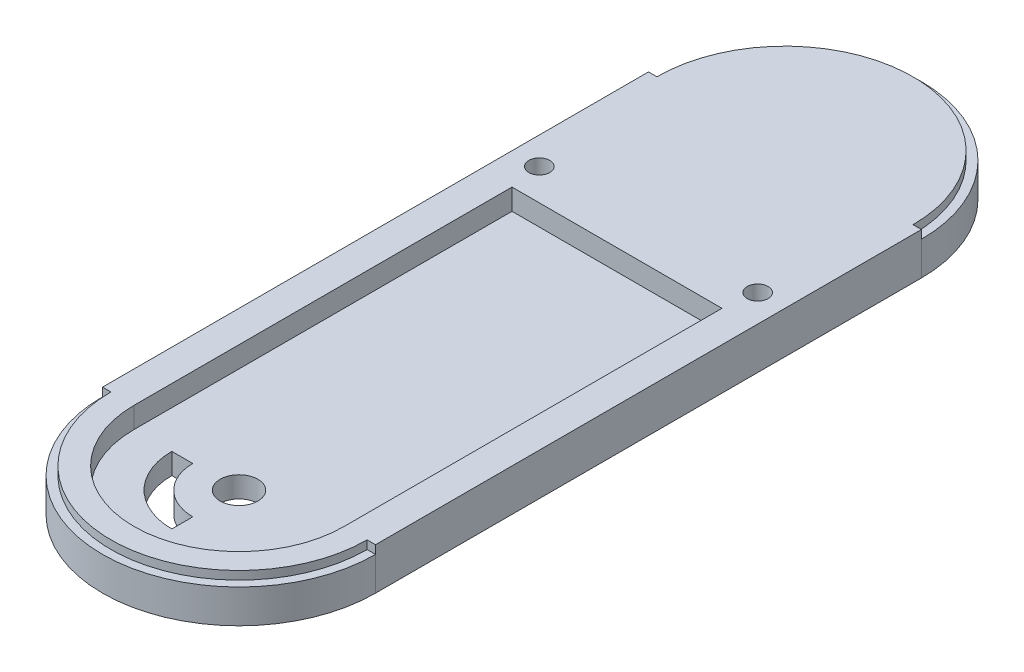
ISO-10303-21;
HEADER;
FILE_DESCRIPTION(('STEP AP214'),'2;1');
FILE_NAME('part.step','',(''),(''),'','','');
FILE_SCHEMA(('AUTOMOTIVE_DESIGN { 1 0 10303 214 1 1 1 1 }'));
ENDSEC;
DATA;
#1=APPLICATION_CONTEXT('core data for automotive mechanical design processes');
#2=APPLICATION_PROTOCOL_DEFINITION('international standard','automotive_design',2000,#1);
#3=PRODUCT_CONTEXT('',#1,'mechanical');
#4=PRODUCT('Part','Part','',(#3));
#5=PRODUCT_RELATED_PRODUCT_CATEGORY('part','',(#4));
#6=PRODUCT_DEFINITION_FORMATION('','',#4);
#7=PRODUCT_DEFINITION_CONTEXT('part definition',#1,'design');
#8=PRODUCT_DEFINITION('design','',#6,#7);
#9=PRODUCT_DEFINITION_SHAPE('','',#8);
#10=(LENGTH_UNIT() NAMED_UNIT(*) SI_UNIT(.MILLI.,.METRE.));
#11=(NAMED_UNIT(*) PLANE_ANGLE_UNIT() SI_UNIT($,.RADIAN.));
#12=(NAMED_UNIT(*) SI_UNIT($,.STERADIAN.) SOLID_ANGLE_UNIT());
#13=UNCERTAINTY_MEASURE_WITH_UNIT(LENGTH_MEASURE(1.E-05),#10,'distance_accuracy_value','');
#14=(GEOMETRIC_REPRESENTATION_CONTEXT(3) GLOBAL_UNCERTAINTY_ASSIGNED_CONTEXT((#13)) GLOBAL_UNIT_ASSIGNED_CONTEXT((#10,
#11,#12)) REPRESENTATION_CONTEXT('',''));
#15=CARTESIAN_POINT('',(0.,0.,0.));
#16=DIRECTION('',(0.,0.,1.));
#17=DIRECTION('',(1.,0.,0.));
#18=AXIS2_PLACEMENT_3D('',#15,#16,#17);
#19=CARTESIAN_POINT('',(0.,10.,65.));
#20=DIRECTION('',(0.,-1.,0.));
#21=DIRECTION('',(0.,0.,-1.));
#22=AXIS2_PLACEMENT_3D('',#19,#20,#21);
#23=CYLINDRICAL_SURFACE('',#22,32.5);
#24=CARTESIAN_POINT('',(0.,8.,65.));
#25=DIRECTION('',(0.,1.,0.));
#26=DIRECTION('',(0.,0.,1.));
#27=AXIS2_PLACEMENT_3D('',#24,#25,#26);
#28=CIRCLE('',#27,32.5);
#29=CARTESIAN_POINT('',(-32.5,8.,65.));
#30=VERTEX_POINT('',#29);
#31=CARTESIAN_POINT('',(32.5,8.,65.));
#32=VERTEX_POINT('',#31);
#33=EDGE_CURVE('E201',#30,#32,#28,.T.);
#34=ORIENTED_EDGE('',*,*,#33,.F.);
#35=DIRECTION('',(0.,-1.,0.));
#36=VECTOR('',#35,1.);
#37=CARTESIAN_POINT('',(-32.5,10.,65.));
#38=LINE('',#37,#36);
#39=CARTESIAN_POINT('',(-32.5,0.,65.));
#40=VERTEX_POINT('',#39);
#41=EDGE_CURVE('E311',#30,#40,#38,.T.);
#42=ORIENTED_EDGE('',*,*,#41,.T.);
#43=CARTESIAN_POINT('',(0.,0.,65.));
#44=DIRECTION('',(0.,1.,0.));
#45=DIRECTION('',(0.,0.,-1.));
#46=AXIS2_PLACEMENT_3D('',#43,#44,#45);
#47=CIRCLE('',#46,32.5);
#48=CARTESIAN_POINT('',(32.5,0.,65.));
#49=VERTEX_POINT('',#48);
#50=EDGE_CURVE('E302',#40,#49,#47,.T.);
#51=ORIENTED_EDGE('',*,*,#50,.T.);
#52=DIRECTION('',(0.,-1.,0.));
#53=VECTOR('',#52,1.);
#54=CARTESIAN_POINT('',(32.5,10.,65.));
#55=LINE('',#54,#53);
#56=EDGE_CURVE('E308',#32,#49,#55,.T.);
#57=ORIENTED_EDGE('',*,*,#56,.F.);
#58=EDGE_LOOP('',(#34,#42,#51,#57));
#59=FACE_BOUND('',#58,.T.);
#60=ADVANCED_FACE('F40',(#59),#23,.T.);
#61=CARTESIAN_POINT('',(0.,10.,-65.0000000000001));
#62=DIRECTION('',(0.,-1.,0.));
#63=DIRECTION('',(0.,0.,-1.));
#64=AXIS2_PLACEMENT_3D('',#61,#62,#63);
#65=CYLINDRICAL_SURFACE('',#64,32.5);
#66=DIRECTION('',(0.,-1.,0.));
#67=VECTOR('',#66,1.);
#68=CARTESIAN_POINT('',(-32.5,10.,-65.0000000000001));
#69=LINE('',#68,#67);
#70=CARTESIAN_POINT('',(-32.5,8.,-65.0000000000001));
#71=VERTEX_POINT('',#70);
#72=CARTESIAN_POINT('',(-32.5,0.,-65.0000000000001));
#73=VERTEX_POINT('',#72);
#74=EDGE_CURVE('E48',#71,#73,#69,.T.);
#75=ORIENTED_EDGE('',*,*,#74,.F.);
#76=CARTESIAN_POINT('',(0.,8.,-65.0000000000001));
#77=DIRECTION('',(0.,1.,0.));
#78=DIRECTION('',(0.,0.,1.));
#79=AXIS2_PLACEMENT_3D('',#76,#77,#78);
#80=CIRCLE('',#79,32.5);
#81=CARTESIAN_POINT('',(32.5,8.,-65.0000000000001));
#82=VERTEX_POINT('',#81);
#83=EDGE_CURVE('E181',#82,#71,#80,.T.);
#84=ORIENTED_EDGE('',*,*,#83,.F.);
#85=DIRECTION('',(0.,-1.,0.));
#86=VECTOR('',#85,1.);
#87=CARTESIAN_POINT('',(32.5,10.,-65.0000000000001));
#88=LINE('',#87,#86);
#89=CARTESIAN_POINT('',(32.5,0.,-65.0000000000001));
#90=VERTEX_POINT('',#89);
#91=EDGE_CURVE('E296',#82,#90,#88,.T.);
#92=ORIENTED_EDGE('',*,*,#91,.T.);
#93=CARTESIAN_POINT('',(0.,0.,-65.0000000000001));
#94=DIRECTION('',(0.,1.,0.));
#95=DIRECTION('',(0.,0.,-1.));
#96=AXIS2_PLACEMENT_3D('',#93,#94,#95);
#97=CIRCLE('',#96,32.5);
#98=EDGE_CURVE('E282',#90,#73,#97,.T.);
#99=ORIENTED_EDGE('',*,*,#98,.T.);
#100=EDGE_LOOP('',(#75,#84,#92,#99));
#101=FACE_BOUND('',#100,.T.);
#102=ADVANCED_FACE('F42',(#101),#65,.T.);
#103=CARTESIAN_POINT('',(-32.5,10.,-65.0000000000001));
#104=DIRECTION('',(1.,0.,0.));
#105=DIRECTION('',(0.,0.,-1.));
#106=AXIS2_PLACEMENT_3D('',#103,#104,#105);
#107=PLANE('',#106);
#108=DIRECTION('',(0.,0.,1.));
#109=VECTOR('',#108,1.);
#110=CARTESIAN_POINT('',(-32.5,0.,-65.0000000000001));
#111=LINE('',#110,#109);
#112=EDGE_CURVE('E299',#73,#40,#111,.T.);
#113=ORIENTED_EDGE('',*,*,#112,.T.);
#114=ORIENTED_EDGE('',*,*,#41,.F.);
#115=CARTESIAN_POINT('',(-32.5,10.,65.));
#116=VERTEX_POINT('',#115);
#117=EDGE_CURVE('E312',#116,#30,#38,.T.);
#118=ORIENTED_EDGE('',*,*,#117,.F.);
#119=DIRECTION('',(0.,0.,1.));
#120=VECTOR('',#119,1.);
#121=CARTESIAN_POINT('',(-32.5,10.,-65.0000000000001));
#122=LINE('',#121,#120);
#123=CARTESIAN_POINT('',(-32.5,10.,-65.0000000000001));
#124=VERTEX_POINT('',#123);
#125=EDGE_CURVE('E289',#124,#116,#122,.T.);
#126=ORIENTED_EDGE('',*,*,#125,.F.);
#127=EDGE_CURVE('E11',#124,#71,#69,.T.);
#128=ORIENTED_EDGE('',*,*,#127,.T.);
#129=ORIENTED_EDGE('',*,*,#74,.T.);
#130=EDGE_LOOP('',(#113,#114,#118,#126,#128,#129));
#131=FACE_BOUND('',#130,.T.);
#132=ADVANCED_FACE('F324',(#131),#107,.F.);
#133=CARTESIAN_POINT('',(32.5,10.,-65.0000000000001));
#134=DIRECTION('',(-1.,0.,0.));
#135=DIRECTION('',(0.,0.,1.));
#136=AXIS2_PLACEMENT_3D('',#133,#134,#135);
#137=PLANE('',#136);
#138=DIRECTION('',(0.,0.,-1.));
#139=VECTOR('',#138,1.);
#140=CARTESIAN_POINT('',(32.5,0.,-65.0000000000001));
#141=LINE('',#140,#139);
#142=EDGE_CURVE('E293',#49,#90,#141,.T.);
#143=ORIENTED_EDGE('',*,*,#142,.T.);
#144=ORIENTED_EDGE('',*,*,#91,.F.);
#145=CARTESIAN_POINT('',(32.5,10.,-65.0000000000001));
#146=VERTEX_POINT('',#145);
#147=EDGE_CURVE('E178',#146,#82,#88,.T.);
#148=ORIENTED_EDGE('',*,*,#147,.F.);
#149=DIRECTION('',(0.,0.,-1.));
#150=VECTOR('',#149,1.);
#151=CARTESIAN_POINT('',(32.5,10.,-65.0000000000001));
#152=LINE('',#151,#150);
#153=CARTESIAN_POINT('',(32.5,10.,65.));
#154=VERTEX_POINT('',#153);
#155=EDGE_CURVE('E292',#154,#146,#152,.T.);
#156=ORIENTED_EDGE('',*,*,#155,.F.);
#157=EDGE_CURVE('E309',#154,#32,#55,.T.);
#158=ORIENTED_EDGE('',*,*,#157,.T.);
#159=ORIENTED_EDGE('',*,*,#56,.T.);
#160=EDGE_LOOP('',(#143,#144,#148,#156,#158,#159));
#161=FACE_BOUND('',#160,.T.);
#162=ADVANCED_FACE('F331',(#161),#137,.F.);
#163=CARTESIAN_POINT('',(0.,10.,-65.0000000000001));
#164=DIRECTION('',(0.,-1.,0.));
#165=DIRECTION('',(0.,0.,-1.));
#166=AXIS2_PLACEMENT_3D('',#163,#164,#165);
#167=PLANE('',#166);
#168=CARTESIAN_POINT('',(26.,10.,-32.5000000000001));
#169=DIRECTION('',(0.,1.,0.));
#170=DIRECTION('',(0.,0.,1.));
#171=AXIS2_PLACEMENT_3D('',#168,#169,#170);
#172=CIRCLE('',#171,2.5);
#173=CARTESIAN_POINT('',(26.,10.,-30.0000000000001));
#174=VERTEX_POINT('',#173);
#175=EDGE_CURVE('E437',#174,#174,#172,.T.);
#176=ORIENTED_EDGE('',*,*,#175,.F.);
#177=EDGE_LOOP('',(#176));
#178=FACE_BOUND('',#177,.T.);
#179=CARTESIAN_POINT('',(-26.,10.,-32.5000000000001));
#180=DIRECTION('',(0.,1.,0.));
#181=DIRECTION('',(0.,0.,1.));
#182=AXIS2_PLACEMENT_3D('',#179,#180,#181);
#183=CIRCLE('',#182,2.5);
#184=CARTESIAN_POINT('',(-26.,10.,-30.0000000000001));
#185=VERTEX_POINT('',#184);
#186=EDGE_CURVE('E191',#185,#185,#183,.T.);
#187=ORIENTED_EDGE('',*,*,#186,.F.);
#188=EDGE_LOOP('',(#187));
#189=FACE_BOUND('',#188,.T.);
#190=DIRECTION('',(0.,0.,-1.));
#191=VECTOR('',#190,1.);
#192=CARTESIAN_POINT('',(25.,10.,-25.));
#193=LINE('',#192,#191);
#194=CARTESIAN_POINT('',(25.,10.,65.));
#195=VERTEX_POINT('',#194);
#196=CARTESIAN_POINT('',(25.,10.,-25.));
#197=VERTEX_POINT('',#196);
#198=EDGE_CURVE('E272',#195,#197,#193,.T.);
#199=ORIENTED_EDGE('',*,*,#198,.F.);
#200=CARTESIAN_POINT('',(0.,10.,65.));
#201=DIRECTION('',(0.,1.,0.));
#202=DIRECTION('',(0.,0.,-1.));
#203=AXIS2_PLACEMENT_3D('',#200,#201,#202);
#204=CIRCLE('',#203,25.);
#205=CARTESIAN_POINT('',(-25.,10.,65.));
#206=VERTEX_POINT('',#205);
#207=EDGE_CURVE('E254',#206,#195,#204,.T.);
#208=ORIENTED_EDGE('',*,*,#207,.F.);
#209=DIRECTION('',(0.,0.,1.));
#210=VECTOR('',#209,1.);
#211=CARTESIAN_POINT('',(-25.,10.,65.));
#212=LINE('',#211,#210);
#213=CARTESIAN_POINT('',(-25.,10.,-25.));
#214=VERTEX_POINT('',#213);
#215=EDGE_CURVE('E261',#214,#206,#212,.T.);
#216=ORIENTED_EDGE('',*,*,#215,.F.);
#217=DIRECTION('',(-1.,0.,0.));
#218=VECTOR('',#217,1.);
#219=CARTESIAN_POINT('',(-25.,10.,-25.));
#220=LINE('',#219,#218);
#221=EDGE_CURVE('E275',#197,#214,#220,.T.);
#222=ORIENTED_EDGE('',*,*,#221,.F.);
#223=EDGE_LOOP('',(#199,#208,#216,#222));
#224=FACE_BOUND('',#223,.T.);
#225=CARTESIAN_POINT('',(0.,10.,-65.0000000000001));
#226=DIRECTION('',(0.,-1.,0.));
#227=DIRECTION('',(0.,0.,-1.));
#228=AXIS2_PLACEMENT_3D('',#225,#226,#227);
#229=CIRCLE('',#228,30.5);
#230=CARTESIAN_POINT('',(-30.5,10.,-65.0000000000001));
#231=VERTEX_POINT('',#230);
#232=CARTESIAN_POINT('',(30.5,10.,-65.0000000000001));
#233=VERTEX_POINT('',#232);
#234=EDGE_CURVE('E55',#231,#233,#229,.T.);
#235=ORIENTED_EDGE('',*,*,#234,.F.);
#236=DIRECTION('',(1.,0.,0.));
#237=VECTOR('',#236,1.);
#238=CARTESIAN_POINT('',(-30.5,10.,-65.0000000000001));
#239=LINE('',#238,#237);
#240=EDGE_CURVE('E185',#124,#231,#239,.T.);
#241=ORIENTED_EDGE('',*,*,#240,.F.);
#242=ORIENTED_EDGE('',*,*,#125,.T.);
#243=DIRECTION('',(-1.,0.,0.));
#244=VECTOR('',#243,1.);
#245=CARTESIAN_POINT('',(-32.5,10.,65.));
#246=LINE('',#245,#244);
#247=CARTESIAN_POINT('',(-30.5,10.,65.));
#248=VERTEX_POINT('',#247);
#249=EDGE_CURVE('E205',#248,#116,#246,.T.);
#250=ORIENTED_EDGE('',*,*,#249,.F.);
#251=CARTESIAN_POINT('',(0.,10.,65.));
#252=DIRECTION('',(0.,-1.,0.));
#253=DIRECTION('',(0.,0.,1.));
#254=AXIS2_PLACEMENT_3D('',#251,#252,#253);
#255=CIRCLE('',#254,30.5);
#256=CARTESIAN_POINT('',(30.5,10.,65.));
#257=VERTEX_POINT('',#256);
#258=EDGE_CURVE('E218',#257,#248,#255,.T.);
#259=ORIENTED_EDGE('',*,*,#258,.F.);
#260=DIRECTION('',(-1.,0.,0.));
#261=VECTOR('',#260,1.);
#262=CARTESIAN_POINT('',(30.5,10.,65.));
#263=LINE('',#262,#261);
#264=EDGE_CURVE('E215',#154,#257,#263,.T.);
#265=ORIENTED_EDGE('',*,*,#264,.F.);
#266=ORIENTED_EDGE('',*,*,#155,.T.);
#267=DIRECTION('',(1.,0.,0.));
#268=VECTOR('',#267,1.);
#269=CARTESIAN_POINT('',(30.5,10.,-65.0000000000001));
#270=LINE('',#269,#268);
#271=EDGE_CURVE('E188',#233,#146,#270,.T.);
#272=ORIENTED_EDGE('',*,*,#271,.F.);
#273=EDGE_LOOP('',(#235,#241,#242,#250,#259,#265,#266,#272));
#274=FACE_BOUND('',#273,.T.);
#275=ADVANCED_FACE('F338',(#178,#189,#224,#274),#167,.F.);
#276=CARTESIAN_POINT('',(0.,0.,-65.0000000000001));
#277=DIRECTION('',(0.,-1.,0.));
#278=DIRECTION('',(0.,0.,-1.));
#279=AXIS2_PLACEMENT_3D('',#276,#277,#278);
#280=PLANE('',#279);
#281=CARTESIAN_POINT('',(26.,0.,-32.5000000000001));
#282=DIRECTION('',(0.,1.,0.));
#283=DIRECTION('',(0.,0.,1.));
#284=AXIS2_PLACEMENT_3D('',#281,#282,#283);
#285=CIRCLE('',#284,2.5);
#286=CARTESIAN_POINT('',(26.,0.,-30.0000000000001));
#287=VERTEX_POINT('',#286);
#288=EDGE_CURVE('E219',#287,#287,#285,.T.);
#289=ORIENTED_EDGE('',*,*,#288,.T.);
#290=EDGE_LOOP('',(#289));
#291=FACE_BOUND('',#290,.T.);
#292=CARTESIAN_POINT('',(-26.,0.,-32.5000000000001));
#293=DIRECTION('',(0.,1.,0.));
#294=DIRECTION('',(0.,0.,1.));
#295=AXIS2_PLACEMENT_3D('',#292,#293,#294);
#296=CIRCLE('',#295,2.5);
#297=CARTESIAN_POINT('',(-26.,0.,-30.0000000000001));
#298=VERTEX_POINT('',#297);
#299=EDGE_CURVE('E438',#298,#298,#296,.T.);
#300=ORIENTED_EDGE('',*,*,#299,.T.);
#301=EDGE_LOOP('',(#300));
#302=FACE_BOUND('',#301,.T.);
#303=CARTESIAN_POINT('',(0.,0.,65.));
#304=DIRECTION('',(0.,-1.,0.));
#305=DIRECTION('',(0.,0.,-1.));
#306=AXIS2_PLACEMENT_3D('',#303,#304,#305);
#307=CIRCLE('',#306,11.);
#308=CARTESIAN_POINT('',(-11.,0.,65.));
#309=VERTEX_POINT('',#308);
#310=CARTESIAN_POINT('',(0.,0.,76.));
#311=VERTEX_POINT('',#310);
#312=EDGE_CURVE('E248',#309,#311,#307,.F.);
#313=ORIENTED_EDGE('',*,*,#312,.F.);
#314=DIRECTION('',(1.,0.,0.));
#315=VECTOR('',#314,1.);
#316=CARTESIAN_POINT('',(0.,0.,65.));
#317=LINE('',#316,#315);
#318=CARTESIAN_POINT('',(-16.,0.,65.));
#319=VERTEX_POINT('',#318);
#320=EDGE_CURVE('E237',#319,#309,#317,.T.);
#321=ORIENTED_EDGE('',*,*,#320,.F.);
#322=CARTESIAN_POINT('',(0.,0.,65.));
#323=DIRECTION('',(0.,-1.,0.));
#324=DIRECTION('',(0.,0.,-1.));
#325=AXIS2_PLACEMENT_3D('',#322,#323,#324);
#326=CIRCLE('',#325,16.);
#327=CARTESIAN_POINT('',(0.,0.,81.));
#328=VERTEX_POINT('',#327);
#329=EDGE_CURVE('E244',#328,#319,#326,.T.);
#330=ORIENTED_EDGE('',*,*,#329,.F.);
#331=DIRECTION('',(0.,0.,1.));
#332=VECTOR('',#331,1.);
#333=CARTESIAN_POINT('',(0.,0.,-65.0000000000001));
#334=LINE('',#333,#332);
#335=EDGE_CURVE('E246',#311,#328,#334,.T.);
#336=ORIENTED_EDGE('',*,*,#335,.F.);
#337=EDGE_LOOP('',(#313,#321,#330,#336));
#338=FACE_BOUND('',#337,.T.);
#339=CARTESIAN_POINT('',(0.,0.,65.));
#340=DIRECTION('',(0.,1.,0.));
#341=DIRECTION('',(0.,0.,1.));
#342=AXIS2_PLACEMENT_3D('',#339,#340,#341);
#343=CIRCLE('',#342,4.5);
#344=CARTESIAN_POINT('',(0.,0.,69.5));
#345=VERTEX_POINT('',#344);
#346=EDGE_CURVE('E251',#345,#345,#343,.T.);
#347=ORIENTED_EDGE('',*,*,#346,.T.);
#348=EDGE_LOOP('',(#347));
#349=FACE_BOUND('',#348,.T.);
#350=ORIENTED_EDGE('',*,*,#98,.F.);
#351=ORIENTED_EDGE('',*,*,#142,.F.);
#352=ORIENTED_EDGE('',*,*,#50,.F.);
#353=ORIENTED_EDGE('',*,*,#112,.F.);
#354=EDGE_LOOP('',(#350,#351,#352,#353));
#355=FACE_BOUND('',#354,.T.);
#356=ADVANCED_FACE('F328',(#291,#302,#338,#349,#355),#280,.T.);
#357=CARTESIAN_POINT('',(0.,5.,65.));
#358=DIRECTION('',(0.,1.,0.));
#359=DIRECTION('',(0.,0.,1.));
#360=AXIS2_PLACEMENT_3D('',#357,#358,#359);
#361=CYLINDRICAL_SURFACE('',#360,25.);
#362=ORIENTED_EDGE('',*,*,#207,.T.);
#363=DIRECTION('',(0.,1.,0.));
#364=VECTOR('',#363,1.);
#365=CARTESIAN_POINT('',(25.,5.,65.));
#366=LINE('',#365,#364);
#367=CARTESIAN_POINT('',(25.,5.,65.));
#368=VERTEX_POINT('',#367);
#369=EDGE_CURVE('E270',#368,#195,#366,.T.);
#370=ORIENTED_EDGE('',*,*,#369,.F.);
#371=CARTESIAN_POINT('',(0.,5.,65.));
#372=DIRECTION('',(0.,1.,0.));
#373=DIRECTION('',(0.,0.,-1.));
#374=AXIS2_PLACEMENT_3D('',#371,#372,#373);
#375=CIRCLE('',#374,25.);
#376=CARTESIAN_POINT('',(-25.,5.,65.));
#377=VERTEX_POINT('',#376);
#378=EDGE_CURVE('E257',#377,#368,#375,.T.);
#379=ORIENTED_EDGE('',*,*,#378,.F.);
#380=DIRECTION('',(0.,1.,0.));
#381=VECTOR('',#380,1.);
#382=CARTESIAN_POINT('',(-25.,5.,65.));
#383=LINE('',#382,#381);
#384=EDGE_CURVE('E280',#377,#206,#383,.T.);
#385=ORIENTED_EDGE('',*,*,#384,.T.);
#386=EDGE_LOOP('',(#362,#370,#379,#385));
#387=FACE_BOUND('',#386,.T.);
#388=ADVANCED_FACE('F364',(#387),#361,.F.);
#389=CARTESIAN_POINT('',(-25.,5.,65.));
#390=DIRECTION('',(-1.,0.,0.));
#391=DIRECTION('',(0.,0.,1.));
#392=AXIS2_PLACEMENT_3D('',#389,#390,#391);
#393=PLANE('',#392);
#394=ORIENTED_EDGE('',*,*,#215,.T.);
#395=ORIENTED_EDGE('',*,*,#384,.F.);
#396=DIRECTION('',(0.,0.,1.));
#397=VECTOR('',#396,1.);
#398=CARTESIAN_POINT('',(-25.,5.,65.));
#399=LINE('',#398,#397);
#400=CARTESIAN_POINT('',(-25.,5.,-25.));
#401=VERTEX_POINT('',#400);
#402=EDGE_CURVE('E267',#401,#377,#399,.T.);
#403=ORIENTED_EDGE('',*,*,#402,.F.);
#404=DIRECTION('',(0.,1.,0.));
#405=VECTOR('',#404,1.);
#406=CARTESIAN_POINT('',(-25.,5.,-25.));
#407=LINE('',#406,#405);
#408=EDGE_CURVE('E283',#401,#214,#407,.T.);
#409=ORIENTED_EDGE('',*,*,#408,.T.);
#410=EDGE_LOOP('',(#394,#395,#403,#409));
#411=FACE_BOUND('',#410,.T.);
#412=ADVANCED_FACE('F371',(#411),#393,.F.);
#413=CARTESIAN_POINT('',(-25.,5.,-25.));
#414=DIRECTION('',(0.,0.,-1.));
#415=DIRECTION('',(-1.,0.,0.));
#416=AXIS2_PLACEMENT_3D('',#413,#414,#415);
#417=PLANE('',#416);
#418=ORIENTED_EDGE('',*,*,#221,.T.);
#419=ORIENTED_EDGE('',*,*,#408,.F.);
#420=DIRECTION('',(-1.,0.,0.));
#421=VECTOR('',#420,1.);
#422=CARTESIAN_POINT('',(-25.,5.,-25.));
#423=LINE('',#422,#421);
#424=CARTESIAN_POINT('',(25.,5.,-25.));
#425=VERTEX_POINT('',#424);
#426=EDGE_CURVE('E264',#425,#401,#423,.T.);
#427=ORIENTED_EDGE('',*,*,#426,.F.);
#428=DIRECTION('',(0.,1.,0.));
#429=VECTOR('',#428,1.);
#430=CARTESIAN_POINT('',(25.,5.,-25.));
#431=LINE('',#430,#429);
#432=EDGE_CURVE('E285',#425,#197,#431,.T.);
#433=ORIENTED_EDGE('',*,*,#432,.T.);
#434=EDGE_LOOP('',(#418,#419,#427,#433));
#435=FACE_BOUND('',#434,.T.);
#436=ADVANCED_FACE('F377',(#435),#417,.F.);
#437=CARTESIAN_POINT('',(25.,5.,-25.));
#438=DIRECTION('',(1.,0.,0.));
#439=DIRECTION('',(0.,0.,-1.));
#440=AXIS2_PLACEMENT_3D('',#437,#438,#439);
#441=PLANE('',#440);
#442=ORIENTED_EDGE('',*,*,#198,.T.);
#443=ORIENTED_EDGE('',*,*,#432,.F.);
#444=DIRECTION('',(0.,0.,-1.));
#445=VECTOR('',#444,1.);
#446=CARTESIAN_POINT('',(25.,5.,-25.));
#447=LINE('',#446,#445);
#448=EDGE_CURVE('E260',#368,#425,#447,.T.);
#449=ORIENTED_EDGE('',*,*,#448,.F.);
#450=ORIENTED_EDGE('',*,*,#369,.T.);
#451=EDGE_LOOP('',(#442,#443,#449,#450));
#452=FACE_BOUND('',#451,.T.);
#453=ADVANCED_FACE('F373',(#452),#441,.F.);
#454=CARTESIAN_POINT('',(0.,5.,65.));
#455=DIRECTION('',(0.,-1.,0.));
#456=DIRECTION('',(0.,0.,-1.));
#457=AXIS2_PLACEMENT_3D('',#454,#455,#456);
#458=PLANE('',#457);
#459=DIRECTION('',(-1.,0.,0.));
#460=VECTOR('',#459,1.);
#461=CARTESIAN_POINT('',(-16.,5.,65.));
#462=LINE('',#461,#460);
#463=CARTESIAN_POINT('',(-11.,5.,65.));
#464=VERTEX_POINT('',#463);
#465=CARTESIAN_POINT('',(-16.,5.,65.));
#466=VERTEX_POINT('',#465);
#467=EDGE_CURVE('E226',#464,#466,#462,.T.);
#468=ORIENTED_EDGE('',*,*,#467,.F.);
#469=CARTESIAN_POINT('',(0.,5.,65.));
#470=DIRECTION('',(0.,-1.,0.));
#471=DIRECTION('',(0.,0.,1.));
#472=AXIS2_PLACEMENT_3D('',#469,#470,#471);
#473=CIRCLE('',#472,11.);
#474=CARTESIAN_POINT('',(0.,5.,76.));
#475=VERTEX_POINT('',#474);
#476=EDGE_CURVE('E199',#475,#464,#473,.T.);
#477=ORIENTED_EDGE('',*,*,#476,.F.);
#478=DIRECTION('',(0.,0.,-1.));
#479=VECTOR('',#478,1.);
#480=CARTESIAN_POINT('',(0.,5.,76.));
#481=LINE('',#480,#479);
#482=CARTESIAN_POINT('',(0.,5.,81.));
#483=VERTEX_POINT('',#482);
#484=EDGE_CURVE('E231',#483,#475,#481,.T.);
#485=ORIENTED_EDGE('',*,*,#484,.F.);
#486=CARTESIAN_POINT('',(0.,5.,65.));
#487=DIRECTION('',(0.,1.,0.));
#488=DIRECTION('',(0.,0.,1.));
#489=AXIS2_PLACEMENT_3D('',#486,#487,#488);
#490=CIRCLE('',#489,16.);
#491=EDGE_CURVE('E228',#466,#483,#490,.T.);
#492=ORIENTED_EDGE('',*,*,#491,.F.);
#493=EDGE_LOOP('',(#468,#477,#485,#492));
#494=FACE_BOUND('',#493,.T.);
#495=CARTESIAN_POINT('',(0.,5.,65.));
#496=DIRECTION('',(0.,1.,0.));
#497=DIRECTION('',(0.,0.,1.));
#498=AXIS2_PLACEMENT_3D('',#495,#496,#497);
#499=CIRCLE('',#498,4.5);
#500=CARTESIAN_POINT('',(0.,5.,69.5));
#501=VERTEX_POINT('',#500);
#502=EDGE_CURVE('E250',#501,#501,#499,.T.);
#503=ORIENTED_EDGE('',*,*,#502,.F.);
#504=EDGE_LOOP('',(#503));
#505=FACE_BOUND('',#504,.T.);
#506=ORIENTED_EDGE('',*,*,#378,.T.);
#507=ORIENTED_EDGE('',*,*,#448,.T.);
#508=ORIENTED_EDGE('',*,*,#426,.T.);
#509=ORIENTED_EDGE('',*,*,#402,.T.);
#510=EDGE_LOOP('',(#506,#507,#508,#509));
#511=FACE_BOUND('',#510,.T.);
#512=ADVANCED_FACE('F376',(#494,#505,#511),#458,.F.);
#513=CARTESIAN_POINT('',(0.,0.,65.));
#514=DIRECTION('',(0.,1.,0.));
#515=DIRECTION('',(0.,0.,1.));
#516=AXIS2_PLACEMENT_3D('',#513,#514,#515);
#517=CYLINDRICAL_SURFACE('',#516,4.5);
#518=ORIENTED_EDGE('',*,*,#346,.F.);
#519=EDGE_LOOP('',(#518));
#520=FACE_BOUND('',#519,.T.);
#521=ORIENTED_EDGE('',*,*,#502,.T.);
#522=EDGE_LOOP('',(#521));
#523=FACE_BOUND('',#522,.T.);
#524=ADVANCED_FACE('F387',(#520,#523),#517,.F.);
#525=CARTESIAN_POINT('',(0.,-5.,65.));
#526=DIRECTION('',(0.,1.,0.));
#527=DIRECTION('',(0.,0.,1.));
#528=AXIS2_PLACEMENT_3D('',#525,#526,#527);
#529=CYLINDRICAL_SURFACE('',#528,11.);
#530=ORIENTED_EDGE('',*,*,#312,.T.);
#531=DIRECTION('',(0.,1.,0.));
#532=VECTOR('',#531,1.);
#533=CARTESIAN_POINT('',(0.,-5.,76.));
#534=LINE('',#533,#532);
#535=EDGE_CURVE('E235',#311,#475,#534,.T.);
#536=ORIENTED_EDGE('',*,*,#535,.T.);
#537=ORIENTED_EDGE('',*,*,#476,.T.);
#538=DIRECTION('',(0.,1.,0.));
#539=VECTOR('',#538,1.);
#540=CARTESIAN_POINT('',(-11.,-5.,65.));
#541=LINE('',#540,#539);
#542=EDGE_CURVE('E234',#309,#464,#541,.T.);
#543=ORIENTED_EDGE('',*,*,#542,.F.);
#544=EDGE_LOOP('',(#530,#536,#537,#543));
#545=FACE_BOUND('',#544,.T.);
#546=ADVANCED_FACE('F391',(#545),#529,.T.);
#547=CARTESIAN_POINT('',(0.,-5.,76.));
#548=DIRECTION('',(1.,0.,0.));
#549=DIRECTION('',(0.,0.,-1.));
#550=AXIS2_PLACEMENT_3D('',#547,#548,#549);
#551=PLANE('',#550);
#552=ORIENTED_EDGE('',*,*,#335,.T.);
#553=DIRECTION('',(0.,1.,0.));
#554=VECTOR('',#553,1.);
#555=CARTESIAN_POINT('',(0.,-5.,81.));
#556=LINE('',#555,#554);
#557=EDGE_CURVE('E238',#328,#483,#556,.T.);
#558=ORIENTED_EDGE('',*,*,#557,.T.);
#559=ORIENTED_EDGE('',*,*,#484,.T.);
#560=ORIENTED_EDGE('',*,*,#535,.F.);
#561=EDGE_LOOP('',(#552,#558,#559,#560));
#562=FACE_BOUND('',#561,.T.);
#563=ADVANCED_FACE('F395',(#562),#551,.F.);
#564=CARTESIAN_POINT('',(0.,-5.,65.));
#565=DIRECTION('',(0.,1.,0.));
#566=DIRECTION('',(0.,0.,1.));
#567=AXIS2_PLACEMENT_3D('',#564,#565,#566);
#568=CYLINDRICAL_SURFACE('',#567,16.);
#569=ORIENTED_EDGE('',*,*,#329,.T.);
#570=DIRECTION('',(0.,1.,0.));
#571=VECTOR('',#570,1.);
#572=CARTESIAN_POINT('',(-16.,-5.,65.));
#573=LINE('',#572,#571);
#574=EDGE_CURVE('E63',#319,#466,#573,.T.);
#575=ORIENTED_EDGE('',*,*,#574,.T.);
#576=ORIENTED_EDGE('',*,*,#491,.T.);
#577=ORIENTED_EDGE('',*,*,#557,.F.);
#578=EDGE_LOOP('',(#569,#575,#576,#577));
#579=FACE_BOUND('',#578,.T.);
#580=ADVANCED_FACE('F400',(#579),#568,.F.);
#581=CARTESIAN_POINT('',(-16.,-5.,65.));
#582=DIRECTION('',(0.,0.,-1.));
#583=DIRECTION('',(-1.,0.,0.));
#584=AXIS2_PLACEMENT_3D('',#581,#582,#583);
#585=PLANE('',#584);
#586=ORIENTED_EDGE('',*,*,#320,.T.);
#587=ORIENTED_EDGE('',*,*,#542,.T.);
#588=ORIENTED_EDGE('',*,*,#467,.T.);
#589=ORIENTED_EDGE('',*,*,#574,.F.);
#590=EDGE_LOOP('',(#586,#587,#588,#589));
#591=FACE_BOUND('',#590,.T.);
#592=ADVANCED_FACE('F397',(#591),#585,.F.);
#593=CARTESIAN_POINT('',(-32.5,8.,65.));
#594=DIRECTION('',(0.,0.,-1.));
#595=DIRECTION('',(-1.,0.,0.));
#596=AXIS2_PLACEMENT_3D('',#593,#594,#595);
#597=PLANE('',#596);
#598=ORIENTED_EDGE('',*,*,#249,.T.);
#599=ORIENTED_EDGE('',*,*,#117,.T.);
#600=DIRECTION('',(-1.,0.,0.));
#601=VECTOR('',#600,1.);
#602=CARTESIAN_POINT('',(-32.5,8.,65.));
#603=LINE('',#602,#601);
#604=CARTESIAN_POINT('',(-30.5,8.,65.));
#605=VERTEX_POINT('',#604);
#606=EDGE_CURVE('E211',#605,#30,#603,.T.);
#607=ORIENTED_EDGE('',*,*,#606,.F.);
#608=DIRECTION('',(0.,1.,0.));
#609=VECTOR('',#608,1.);
#610=CARTESIAN_POINT('',(-30.5,8.,65.));
#611=LINE('',#610,#609);
#612=EDGE_CURVE('E197',#605,#248,#611,.T.);
#613=ORIENTED_EDGE('',*,*,#612,.T.);
#614=EDGE_LOOP('',(#598,#599,#607,#613));
#615=FACE_BOUND('',#614,.T.);
#616=ADVANCED_FACE('F345',(#615),#597,.F.);
#617=CARTESIAN_POINT('',(0.,8.,65.));
#618=DIRECTION('',(0.,1.,0.));
#619=DIRECTION('',(0.,0.,1.));
#620=AXIS2_PLACEMENT_3D('',#617,#618,#619);
#621=CYLINDRICAL_SURFACE('',#620,30.5);
#622=ORIENTED_EDGE('',*,*,#258,.T.);
#623=ORIENTED_EDGE('',*,*,#612,.F.);
#624=CARTESIAN_POINT('',(0.,8.,65.));
#625=DIRECTION('',(0.,-1.,0.));
#626=DIRECTION('',(0.,0.,1.));
#627=AXIS2_PLACEMENT_3D('',#624,#625,#626);
#628=CIRCLE('',#627,30.5);
#629=CARTESIAN_POINT('',(30.5,8.,65.));
#630=VERTEX_POINT('',#629);
#631=EDGE_CURVE('E208',#630,#605,#628,.T.);
#632=ORIENTED_EDGE('',*,*,#631,.F.);
#633=DIRECTION('',(0.,1.,0.));
#634=VECTOR('',#633,1.);
#635=CARTESIAN_POINT('',(30.5,8.,65.));
#636=LINE('',#635,#634);
#637=EDGE_CURVE('E214',#630,#257,#636,.T.);
#638=ORIENTED_EDGE('',*,*,#637,.T.);
#639=EDGE_LOOP('',(#622,#623,#632,#638));
#640=FACE_BOUND('',#639,.T.);
#641=ADVANCED_FACE('F341',(#640),#621,.T.);
#642=CARTESIAN_POINT('',(30.5,8.,65.));
#643=DIRECTION('',(0.,0.,-1.));
#644=DIRECTION('',(-1.,0.,0.));
#645=AXIS2_PLACEMENT_3D('',#642,#643,#644);
#646=PLANE('',#645);
#647=ORIENTED_EDGE('',*,*,#264,.T.);
#648=ORIENTED_EDGE('',*,*,#637,.F.);
#649=DIRECTION('',(-1.,0.,0.));
#650=VECTOR('',#649,1.);
#651=CARTESIAN_POINT('',(30.5,8.,65.));
#652=LINE('',#651,#650);
#653=EDGE_CURVE('E204',#32,#630,#652,.T.);
#654=ORIENTED_EDGE('',*,*,#653,.F.);
#655=ORIENTED_EDGE('',*,*,#157,.F.);
#656=EDGE_LOOP('',(#647,#648,#654,#655));
#657=FACE_BOUND('',#656,.T.);
#658=ADVANCED_FACE('F335',(#657),#646,.F.);
#659=CARTESIAN_POINT('',(0.,8.,65.));
#660=DIRECTION('',(0.,1.,0.));
#661=DIRECTION('',(0.,0.,1.));
#662=AXIS2_PLACEMENT_3D('',#659,#660,#661);
#663=PLANE('',#662);
#664=ORIENTED_EDGE('',*,*,#33,.T.);
#665=ORIENTED_EDGE('',*,*,#653,.T.);
#666=ORIENTED_EDGE('',*,*,#631,.T.);
#667=ORIENTED_EDGE('',*,*,#606,.T.);
#668=EDGE_LOOP('',(#664,#665,#666,#667));
#669=FACE_BOUND('',#668,.T.);
#670=ADVANCED_FACE('F344',(#669),#663,.T.);
#671=CARTESIAN_POINT('',(0.,8.,-65.0000000000001));
#672=DIRECTION('',(0.,1.,0.));
#673=DIRECTION('',(0.,0.,1.));
#674=AXIS2_PLACEMENT_3D('',#671,#672,#673);
#675=CYLINDRICAL_SURFACE('',#674,30.5);
#676=ORIENTED_EDGE('',*,*,#234,.T.);
#677=DIRECTION('',(0.,1.,0.));
#678=VECTOR('',#677,1.);
#679=CARTESIAN_POINT('',(30.5,8.,-65.0000000000001));
#680=LINE('',#679,#678);
#681=CARTESIAN_POINT('',(30.5,8.,-65.0000000000001));
#682=VERTEX_POINT('',#681);
#683=EDGE_CURVE('E163',#682,#233,#680,.T.);
#684=ORIENTED_EDGE('',*,*,#683,.F.);
#685=CARTESIAN_POINT('',(0.,8.,-65.0000000000001));
#686=DIRECTION('',(0.,-1.,0.));
#687=DIRECTION('',(0.,0.,-1.));
#688=AXIS2_PLACEMENT_3D('',#685,#686,#687);
#689=CIRCLE('',#688,30.5);
#690=CARTESIAN_POINT('',(-30.5,8.,-65.0000000000001));
#691=VERTEX_POINT('',#690);
#692=EDGE_CURVE('E167',#691,#682,#689,.T.);
#693=ORIENTED_EDGE('',*,*,#692,.F.);
#694=DIRECTION('',(0.,1.,0.));
#695=VECTOR('',#694,1.);
#696=CARTESIAN_POINT('',(-30.5,8.,-65.0000000000001));
#697=LINE('',#696,#695);
#698=EDGE_CURVE('E171',#691,#231,#697,.T.);
#699=ORIENTED_EDGE('',*,*,#698,.T.);
#700=EDGE_LOOP('',(#676,#684,#693,#699));
#701=FACE_BOUND('',#700,.T.);
#702=ADVANCED_FACE('F165',(#701),#675,.T.);
#703=CARTESIAN_POINT('',(-30.5,8.,-65.0000000000001));
#704=DIRECTION('',(0.,0.,1.));
#705=DIRECTION('',(1.,0.,0.));
#706=AXIS2_PLACEMENT_3D('',#703,#704,#705);
#707=PLANE('',#706);
#708=ORIENTED_EDGE('',*,*,#240,.T.);
#709=ORIENTED_EDGE('',*,*,#698,.F.);
#710=DIRECTION('',(1.,0.,0.));
#711=VECTOR('',#710,1.);
#712=CARTESIAN_POINT('',(-30.5,8.,-65.0000000000001));
#713=LINE('',#712,#711);
#714=EDGE_CURVE('E172',#71,#691,#713,.T.);
#715=ORIENTED_EDGE('',*,*,#714,.F.);
#716=ORIENTED_EDGE('',*,*,#127,.F.);
#717=EDGE_LOOP('',(#708,#709,#715,#716));
#718=FACE_BOUND('',#717,.T.);
#719=ADVANCED_FACE('F349',(#718),#707,.F.);
#720=CARTESIAN_POINT('',(30.5,8.,-65.0000000000001));
#721=DIRECTION('',(0.,0.,1.));
#722=DIRECTION('',(1.,0.,0.));
#723=AXIS2_PLACEMENT_3D('',#720,#721,#722);
#724=PLANE('',#723);
#725=ORIENTED_EDGE('',*,*,#271,.T.);
#726=ORIENTED_EDGE('',*,*,#147,.T.);
#727=DIRECTION('',(1.,0.,0.));
#728=VECTOR('',#727,1.);
#729=CARTESIAN_POINT('',(30.5,8.,-65.0000000000001));
#730=LINE('',#729,#728);
#731=EDGE_CURVE('E175',#682,#82,#730,.T.);
#732=ORIENTED_EDGE('',*,*,#731,.F.);
#733=ORIENTED_EDGE('',*,*,#683,.T.);
#734=EDGE_LOOP('',(#725,#726,#732,#733));
#735=FACE_BOUND('',#734,.T.);
#736=ADVANCED_FACE('F176',(#735),#724,.F.);
#737=CARTESIAN_POINT('',(0.,8.,-65.0000000000001));
#738=DIRECTION('',(0.,-1.,0.));
#739=DIRECTION('',(0.,0.,-1.));
#740=AXIS2_PLACEMENT_3D('',#737,#738,#739);
#741=PLANE('',#740);
#742=ORIENTED_EDGE('',*,*,#692,.T.);
#743=ORIENTED_EDGE('',*,*,#731,.T.);
#744=ORIENTED_EDGE('',*,*,#83,.T.);
#745=ORIENTED_EDGE('',*,*,#714,.T.);
#746=EDGE_LOOP('',(#742,#743,#744,#745));
#747=FACE_BOUND('',#746,.T.);
#748=ADVANCED_FACE('F183',(#747),#741,.F.);
#749=CARTESIAN_POINT('',(-26.,0.,-32.5000000000001));
#750=DIRECTION('',(0.,1.,0.));
#751=DIRECTION('',(0.,0.,1.));
#752=AXIS2_PLACEMENT_3D('',#749,#750,#751);
#753=CYLINDRICAL_SURFACE('',#752,2.5);
#754=ORIENTED_EDGE('',*,*,#299,.F.);
#755=EDGE_LOOP('',(#754));
#756=FACE_BOUND('',#755,.T.);
#757=ORIENTED_EDGE('',*,*,#186,.T.);
#758=EDGE_LOOP('',(#757));
#759=FACE_BOUND('',#758,.T.);
#760=ADVANCED_FACE('F423',(#756,#759),#753,.F.);
#761=CARTESIAN_POINT('',(26.,0.,-32.5000000000001));
#762=DIRECTION('',(0.,1.,0.));
#763=DIRECTION('',(0.,0.,1.));
#764=AXIS2_PLACEMENT_3D('',#761,#762,#763);
#765=CYLINDRICAL_SURFACE('',#764,2.5);
#766=ORIENTED_EDGE('',*,*,#288,.F.);
#767=EDGE_LOOP('',(#766));
#768=FACE_BOUND('',#767,.T.);
#769=ORIENTED_EDGE('',*,*,#175,.T.);
#770=EDGE_LOOP('',(#769));
#771=FACE_BOUND('',#770,.T.);
#772=ADVANCED_FACE('F426',(#768,#771),#765,.F.);
#773=CLOSED_SHELL('',(#60,#102,#132,#162,#275,#356,#388,#412,#436,#453,#512,#524,#546,#563,#580,
#592,#616,#641,#658,#670,#702,#719,#736,#748,#760,#772));
#774=MANIFOLD_SOLID_BREP('B2',#773);
#775=ADVANCED_BREP_SHAPE_REPRESENTATION('',(#18,#774),#14);
#776=SHAPE_DEFINITION_REPRESENTATION(#9,#775);
ENDSEC;
END-ISO-10303-21;
